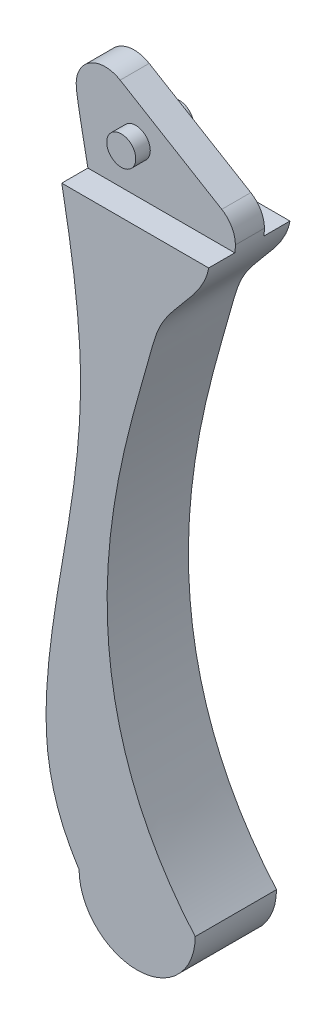
ISO-10303-21;
HEADER;
FILE_DESCRIPTION(('STEP AP214'),'2;1');
FILE_NAME('part.step','',(''),(''),'','','');
FILE_SCHEMA(('AUTOMOTIVE_DESIGN { 1 0 10303 214 1 1 1 1 }'));
ENDSEC;
DATA;
#1=APPLICATION_CONTEXT('core data for automotive mechanical design processes');
#2=APPLICATION_PROTOCOL_DEFINITION('international standard','automotive_design',2000,#1);
#3=PRODUCT_CONTEXT('',#1,'mechanical');
#4=PRODUCT('Part','Part','',(#3));
#5=PRODUCT_RELATED_PRODUCT_CATEGORY('part','',(#4));
#6=PRODUCT_DEFINITION_FORMATION('','',#4);
#7=PRODUCT_DEFINITION_CONTEXT('part definition',#1,'design');
#8=PRODUCT_DEFINITION('design','',#6,#7);
#9=PRODUCT_DEFINITION_SHAPE('','',#8);
#10=(LENGTH_UNIT() NAMED_UNIT(*) SI_UNIT(.MILLI.,.METRE.));
#11=(NAMED_UNIT(*) PLANE_ANGLE_UNIT() SI_UNIT($,.RADIAN.));
#12=(NAMED_UNIT(*) SI_UNIT($,.STERADIAN.) SOLID_ANGLE_UNIT());
#13=UNCERTAINTY_MEASURE_WITH_UNIT(LENGTH_MEASURE(1.E-05),#10,'distance_accuracy_value','');
#14=(GEOMETRIC_REPRESENTATION_CONTEXT(3) GLOBAL_UNCERTAINTY_ASSIGNED_CONTEXT((#13)) GLOBAL_UNIT_ASSIGNED_CONTEXT((#10,
#11,#12)) REPRESENTATION_CONTEXT('',''));
#15=CARTESIAN_POINT('',(0.,0.,0.));
#16=DIRECTION('',(0.,0.,1.));
#17=DIRECTION('',(1.,0.,0.));
#18=AXIS2_PLACEMENT_3D('',#15,#16,#17);
#19=CARTESIAN_POINT('',(-10.,0.,28.));
#20=CARTESIAN_POINT('',(-10.,-6.03362241087099,28.));
#21=CARTESIAN_POINT('',(-1.93515900796353,-36.5677958941885,28.));
#22=CARTESIAN_POINT('',(2.93061813689168,-106.909125291221,28.));
#23=CARTESIAN_POINT('',(-14.496902925897,-160.94466209144,28.));
#24=CARTESIAN_POINT('',(-10.7783777396493,-208.408825579284,28.));
#25=CARTESIAN_POINT('',(3.68142325720505E-13,-225.000000000001,28.));
#26=B_SPLINE_CURVE_WITH_KNOTS('',3,(#19,#20,#21,#22,#23,#24,#25),.UNSPECIFIED.,.F.,.F.,(4,1,1,1,
4),(0.,0.308474866148458,0.388557836899197,0.800829707507387,1.),.UNSPECIFIED.);
#27=DIRECTION('',(0.,0.,-1.));
#28=VECTOR('',#27,1.);
#29=SURFACE_OF_LINEAR_EXTRUSION('',#26,#28);
#30=DIRECTION('',(0.,0.,-1.));
#31=VECTOR('',#30,1.);
#32=CARTESIAN_POINT('',(-10.,0.,28.));
#33=LINE('',#32,#31);
#34=CARTESIAN_POINT('',(-10.,0.,19.));
#35=VERTEX_POINT('',#34);
#36=CARTESIAN_POINT('',(-10.,0.,9.00000000000001));
#37=VERTEX_POINT('',#36);
#38=EDGE_CURVE('E165',#35,#37,#33,.T.);
#39=ORIENTED_EDGE('',*,*,#38,.T.);
#40=CARTESIAN_POINT('',(-10.,0.,9.00000000000001));
#41=CARTESIAN_POINT('',(-10.,-6.03362241087099,9.00000000000001));
#42=CARTESIAN_POINT('',(-1.93515900796353,-36.5677958941885,9.00000000000001));
#43=CARTESIAN_POINT('',(2.93061813689168,-106.909125291221,9.00000000000001));
#44=CARTESIAN_POINT('',(-14.496902925897,-160.94466209144,9.00000000000001));
#45=CARTESIAN_POINT('',(-10.7783777396493,-208.408825579284,9.00000000000001));
#46=CARTESIAN_POINT('',(3.68142325720505E-13,-225.000000000001,9.00000000000001));
#47=B_SPLINE_CURVE_WITH_KNOTS('',3,(#40,#41,#42,#43,#44,#45,#46),.UNSPECIFIED.,.F.,.F.,(4,1,1,1,
4),(0.,0.308474866148458,0.388557836899197,0.800829707507387,1.),.UNSPECIFIED.);
#48=CARTESIAN_POINT('',(-5.96926724813891,-23.2129695897276,9.00000000000001));
#49=VERTEX_POINT('',#48);
#50=EDGE_CURVE('E135',#37,#49,#47,.T.);
#51=ORIENTED_EDGE('',*,*,#50,.T.);
#52=DIRECTION('',(0.,0.,-1.));
#53=VECTOR('',#52,1.);
#54=CARTESIAN_POINT('',(-5.96926724813893,-23.2129695897276,28.));
#55=LINE('',#54,#53);
#56=CARTESIAN_POINT('',(-5.96926724813956,-23.2129695897276,0.));
#57=VERTEX_POINT('',#56);
#58=EDGE_CURVE('E121',#49,#57,#55,.T.);
#59=ORIENTED_EDGE('',*,*,#58,.T.);
#60=CARTESIAN_POINT('',(-10.,0.,0.));
#61=CARTESIAN_POINT('',(-10.,-6.03362241087099,0.));
#62=CARTESIAN_POINT('',(-1.93515900796353,-36.5677958941885,0.));
#63=CARTESIAN_POINT('',(2.93061813689168,-106.909125291221,0.));
#64=CARTESIAN_POINT('',(-14.496902925897,-160.94466209144,0.));
#65=CARTESIAN_POINT('',(-10.7783777396493,-208.408825579284,0.));
#66=CARTESIAN_POINT('',(3.68142325720505E-13,-225.000000000001,0.));
#67=B_SPLINE_CURVE_WITH_KNOTS('',3,(#60,#61,#62,#63,#64,#65,#66),.UNSPECIFIED.,.F.,.F.,(4,1,1,1,
4),(0.,0.308474866148458,0.388557836899197,0.800829707507387,1.),.UNSPECIFIED.);
#68=CARTESIAN_POINT('',(0.,-225.,0.));
#69=VERTEX_POINT('',#68);
#70=EDGE_CURVE('E132',#57,#69,#67,.T.);
#71=ORIENTED_EDGE('',*,*,#70,.T.);
#72=DIRECTION('',(0.,0.,-1.));
#73=VECTOR('',#72,1.);
#74=CARTESIAN_POINT('',(0.,-225.,28.));
#75=LINE('',#74,#73);
#76=CARTESIAN_POINT('',(0.,-225.,28.));
#77=VERTEX_POINT('',#76);
#78=EDGE_CURVE('E187',#77,#69,#75,.T.);
#79=ORIENTED_EDGE('',*,*,#78,.F.);
#80=CARTESIAN_POINT('',(-5.96926724813957,-23.2129695897242,28.));
#81=VERTEX_POINT('',#80);
#82=EDGE_CURVE('E148',#81,#77,#26,.T.);
#83=ORIENTED_EDGE('',*,*,#82,.F.);
#84=DIRECTION('',(0.,0.,-1.));
#85=VECTOR('',#84,1.);
#86=CARTESIAN_POINT('',(-5.96926724813893,-23.2129695897276,28.));
#87=LINE('',#86,#85);
#88=CARTESIAN_POINT('',(-5.96926724813954,-23.2129695897276,19.));
#89=VERTEX_POINT('',#88);
#90=EDGE_CURVE('E67',#89,#81,#87,.F.);
#91=ORIENTED_EDGE('',*,*,#90,.F.);
#92=CARTESIAN_POINT('',(-10.,0.,19.));
#93=CARTESIAN_POINT('',(-10.,-6.03362241087099,19.));
#94=CARTESIAN_POINT('',(-1.93515900796353,-36.5677958941885,19.));
#95=CARTESIAN_POINT('',(2.93061813689168,-106.909125291221,19.));
#96=CARTESIAN_POINT('',(-14.496902925897,-160.94466209144,19.));
#97=CARTESIAN_POINT('',(-10.7783777396493,-208.408825579284,19.));
#98=CARTESIAN_POINT('',(3.68142325720505E-13,-225.000000000001,19.));
#99=B_SPLINE_CURVE_WITH_KNOTS('',3,(#92,#93,#94,#95,#96,#97,#98),.UNSPECIFIED.,.F.,.F.,(4,1,1,1,
4),(0.,0.308474866148458,0.388557836899197,0.800829707507387,1.),.UNSPECIFIED.);
#100=EDGE_CURVE('E199',#35,#89,#99,.T.);
#101=ORIENTED_EDGE('',*,*,#100,.F.);
#102=EDGE_LOOP('',(#39,#51,#59,#71,#79,#83,#91,#101));
#103=FACE_BOUND('',#102,.T.);
#104=ADVANCED_FACE('F43',(#103),#29,.F.);
#105=CARTESIAN_POINT('',(40.0000000000005,-225.000000000001,28.));
#106=CARTESIAN_POINT('',(-10.3800229081239,-166.862499306467,28.));
#107=CARTESIAN_POINT('',(19.0268418331791,-81.3215405612371,28.));
#108=CARTESIAN_POINT('',(28.8894251367706,-41.7828993815234,28.));
#109=CARTESIAN_POINT('',(44.8377491223541,-31.3693909355162,28.));
#110=CARTESIAN_POINT('',(44.8377491223541,-20.7581894326837,28.));
#111=B_SPLINE_CURVE_WITH_KNOTS('',3,(#105,#106,#107,#108,#109,#110),.UNSPECIFIED.,.F.,.F.,(4,1,
1,4),(0.,0.656664832232096,0.756664832232096,1.),.UNSPECIFIED.);
#112=DIRECTION('',(0.,0.,-1.));
#113=VECTOR('',#112,1.);
#114=SURFACE_OF_LINEAR_EXTRUSION('',#111,#113);
#115=DIRECTION('',(0.,0.,-1.));
#116=VECTOR('',#115,1.);
#117=CARTESIAN_POINT('',(44.6351275969466,-23.2129695897276,28.));
#118=LINE('',#117,#116);
#119=CARTESIAN_POINT('',(44.6351275985528,-23.212969580011,0.));
#120=VERTEX_POINT('',#119);
#121=CARTESIAN_POINT('',(44.6351275969466,-23.2129695897276,9.00000000000001));
#122=VERTEX_POINT('',#121);
#123=EDGE_CURVE('E59',#120,#122,#118,.F.);
#124=ORIENTED_EDGE('',*,*,#123,.T.);
#125=CARTESIAN_POINT('',(40.0000000000005,-225.000000000001,9.00000000000001));
#126=CARTESIAN_POINT('',(-10.3800229081239,-166.862499306467,9.00000000000001));
#127=CARTESIAN_POINT('',(19.0268418331791,-81.3215405612371,9.00000000000001));
#128=CARTESIAN_POINT('',(28.8894251367706,-41.7828993815234,9.00000000000001));
#129=CARTESIAN_POINT('',(44.8377491223541,-31.3693909355162,9.00000000000001));
#130=CARTESIAN_POINT('',(44.8377491223541,-20.7581894326837,9.00000000000001));
#131=B_SPLINE_CURVE_WITH_KNOTS('',3,(#125,#126,#127,#128,#129,#130),.UNSPECIFIED.,.F.,.F.,(4,1,
1,4),(0.,0.656664832232096,0.756664832232096,1.),.UNSPECIFIED.);
#132=CARTESIAN_POINT('',(44.8377491223541,-20.7581894326837,9.00000000000001));
#133=VERTEX_POINT('',#132);
#134=EDGE_CURVE('E216',#122,#133,#131,.T.);
#135=ORIENTED_EDGE('',*,*,#134,.T.);
#136=DIRECTION('',(0.,0.,-1.));
#137=VECTOR('',#136,1.);
#138=CARTESIAN_POINT('',(44.8377491223541,-20.7581894326837,28.));
#139=LINE('',#138,#137);
#140=CARTESIAN_POINT('',(44.8377491223541,-20.7581894326837,19.));
#141=VERTEX_POINT('',#140);
#142=EDGE_CURVE('E179',#141,#133,#139,.T.);
#143=ORIENTED_EDGE('',*,*,#142,.F.);
#144=CARTESIAN_POINT('',(40.0000000000005,-225.000000000001,19.));
#145=CARTESIAN_POINT('',(-10.3800229081239,-166.862499306467,19.));
#146=CARTESIAN_POINT('',(19.0268418331791,-81.3215405612371,19.));
#147=CARTESIAN_POINT('',(28.8894251367706,-41.7828993815234,19.));
#148=CARTESIAN_POINT('',(44.8377491223541,-31.3693909355162,19.));
#149=CARTESIAN_POINT('',(44.8377491223541,-20.7581894326837,19.));
#150=B_SPLINE_CURVE_WITH_KNOTS('',3,(#144,#145,#146,#147,#148,#149),.UNSPECIFIED.,.F.,.F.,(4,1,
1,4),(0.,0.656664832232096,0.756664832232096,1.),.UNSPECIFIED.);
#151=CARTESIAN_POINT('',(44.6351275985528,-23.2129695897276,19.));
#152=VERTEX_POINT('',#151);
#153=EDGE_CURVE('E207',#152,#141,#150,.T.);
#154=ORIENTED_EDGE('',*,*,#153,.F.);
#155=DIRECTION('',(0.,0.,-1.));
#156=VECTOR('',#155,1.);
#157=CARTESIAN_POINT('',(44.6351275969466,-23.2129695897276,28.));
#158=LINE('',#157,#156);
#159=CARTESIAN_POINT('',(44.6351275985528,-23.2129695897276,28.));
#160=VERTEX_POINT('',#159);
#161=EDGE_CURVE('E220',#160,#152,#158,.T.);
#162=ORIENTED_EDGE('',*,*,#161,.F.);
#163=CARTESIAN_POINT('',(40.0000000000005,-225.000000000001,28.));
#164=VERTEX_POINT('',#163);
#165=EDGE_CURVE('E155',#164,#160,#111,.T.);
#166=ORIENTED_EDGE('',*,*,#165,.F.);
#167=DIRECTION('',(0.,0.,-1.));
#168=VECTOR('',#167,1.);
#169=CARTESIAN_POINT('',(40.0000000000005,-225.000000000001,28.));
#170=LINE('',#169,#168);
#171=CARTESIAN_POINT('',(40.0000000000005,-225.,0.));
#172=VERTEX_POINT('',#171);
#173=EDGE_CURVE('E183',#164,#172,#170,.T.);
#174=ORIENTED_EDGE('',*,*,#173,.T.);
#175=CARTESIAN_POINT('',(40.0000000000005,-225.000000000001,0.));
#176=CARTESIAN_POINT('',(-10.3800229081239,-166.862499306467,0.));
#177=CARTESIAN_POINT('',(19.0268418331791,-81.3215405612371,0.));
#178=CARTESIAN_POINT('',(28.8894251367706,-41.7828993815234,0.));
#179=CARTESIAN_POINT('',(44.8377491223541,-31.3693909355162,0.));
#180=CARTESIAN_POINT('',(44.8377491223541,-20.7581894326837,0.));
#181=B_SPLINE_CURVE_WITH_KNOTS('',3,(#175,#176,#177,#178,#179,#180),.UNSPECIFIED.,.F.,.F.,(4,1,
1,4),(0.,0.656664832232096,0.756664832232096,1.),.UNSPECIFIED.);
#182=EDGE_CURVE('E144',#172,#120,#181,.T.);
#183=ORIENTED_EDGE('',*,*,#182,.T.);
#184=EDGE_LOOP('',(#124,#135,#143,#154,#162,#166,#174,#183));
#185=FACE_BOUND('',#184,.T.);
#186=ADVANCED_FACE('F272',(#185),#114,.F.);
#187=CARTESIAN_POINT('',(35.1724989171882,-20.7581894326837,28.));
#188=DIRECTION('',(0.,0.,-1.));
#189=DIRECTION('',(-1.,0.,0.));
#190=AXIS2_PLACEMENT_3D('',#187,#188,#189);
#191=CYLINDRICAL_SURFACE('',#190,9.66525020516587);
#192=ORIENTED_EDGE('',*,*,#142,.T.);
#193=CARTESIAN_POINT('',(35.1724989171882,-20.7581894326837,9.00000000000001));
#194=DIRECTION('',(0.,0.,1.));
#195=DIRECTION('',(0.,-1.,0.));
#196=AXIS2_PLACEMENT_3D('',#193,#194,#195);
#197=CIRCLE('',#196,9.66525020516587);
#198=CARTESIAN_POINT('',(40.1530701392559,-12.4750154136032,9.));
#199=VERTEX_POINT('',#198);
#200=EDGE_CURVE('E223',#133,#199,#197,.T.);
#201=ORIENTED_EDGE('',*,*,#200,.T.);
#202=DIRECTION('',(0.,0.,-1.));
#203=VECTOR('',#202,1.);
#204=CARTESIAN_POINT('',(40.1530701392559,-12.4750154136032,28.));
#205=LINE('',#204,#203);
#206=CARTESIAN_POINT('',(40.1530701392559,-12.4750154136032,19.));
#207=VERTEX_POINT('',#206);
#208=EDGE_CURVE('E175',#207,#199,#205,.T.);
#209=ORIENTED_EDGE('',*,*,#208,.F.);
#210=CARTESIAN_POINT('',(35.1724989171882,-20.7581894326837,19.));
#211=DIRECTION('',(0.,0.,1.));
#212=DIRECTION('',(0.,-1.,0.));
#213=AXIS2_PLACEMENT_3D('',#210,#211,#212);
#214=CIRCLE('',#213,9.66525020516587);
#215=EDGE_CURVE('E240',#141,#207,#214,.T.);
#216=ORIENTED_EDGE('',*,*,#215,.F.);
#217=EDGE_LOOP('',(#192,#201,#209,#216));
#218=FACE_BOUND('',#217,.T.);
#219=ADVANCED_FACE('F279',(#218),#191,.T.);
#220=CARTESIAN_POINT('',(5.15307013925591,8.57005648405593,28.));
#221=DIRECTION('',(-0.515307013925591,-0.857005648405593,0.));
#222=DIRECTION('',(0.857005648405593,-0.515307013925591,0.));
#223=AXIS2_PLACEMENT_3D('',#220,#221,#222);
#224=PLANE('',#223);
#225=ORIENTED_EDGE('',*,*,#208,.T.);
#226=DIRECTION('',(-0.857005648405593,0.515307013925591,0.));
#227=VECTOR('',#226,1.);
#228=CARTESIAN_POINT('',(5.15307013925591,8.57005648405593,9.));
#229=LINE('',#228,#227);
#230=CARTESIAN_POINT('',(5.15307013925591,8.57005648405593,9.));
#231=VERTEX_POINT('',#230);
#232=EDGE_CURVE('E137',#199,#231,#229,.T.);
#233=ORIENTED_EDGE('',*,*,#232,.T.);
#234=DIRECTION('',(0.,0.,-1.));
#235=VECTOR('',#234,1.);
#236=CARTESIAN_POINT('',(5.15307013925591,8.57005648405593,28.));
#237=LINE('',#236,#235);
#238=CARTESIAN_POINT('',(5.15307013925591,8.57005648405593,19.));
#239=VERTEX_POINT('',#238);
#240=EDGE_CURVE('E171',#239,#231,#237,.T.);
#241=ORIENTED_EDGE('',*,*,#240,.F.);
#242=DIRECTION('',(-0.857005648405593,0.515307013925591,0.));
#243=VECTOR('',#242,1.);
#244=CARTESIAN_POINT('',(5.15307013925591,8.57005648405593,19.));
#245=LINE('',#244,#243);
#246=EDGE_CURVE('E201',#207,#239,#245,.T.);
#247=ORIENTED_EDGE('',*,*,#246,.F.);
#248=EDGE_LOOP('',(#225,#233,#241,#247));
#249=FACE_BOUND('',#248,.T.);
#250=ADVANCED_FACE('F295',(#249),#224,.F.);
#251=CARTESIAN_POINT('',(0.,0.,28.));
#252=DIRECTION('',(0.,0.,-1.));
#253=DIRECTION('',(-1.,0.,0.));
#254=AXIS2_PLACEMENT_3D('',#251,#252,#253);
#255=CYLINDRICAL_SURFACE('',#254,10.);
#256=CARTESIAN_POINT('',(0.,0.,9.00000000000001));
#257=DIRECTION('',(0.,0.,1.));
#258=DIRECTION('',(0.,-1.,0.));
#259=AXIS2_PLACEMENT_3D('',#256,#257,#258);
#260=CIRCLE('',#259,10.);
#261=EDGE_CURVE('E11',#231,#37,#260,.T.);
#262=ORIENTED_EDGE('',*,*,#261,.T.);
#263=ORIENTED_EDGE('',*,*,#38,.F.);
#264=CARTESIAN_POINT('',(0.,0.,19.));
#265=DIRECTION('',(0.,0.,1.));
#266=DIRECTION('',(0.,-1.,0.));
#267=AXIS2_PLACEMENT_3D('',#264,#265,#266);
#268=CIRCLE('',#267,10.);
#269=EDGE_CURVE('E127',#239,#35,#268,.T.);
#270=ORIENTED_EDGE('',*,*,#269,.F.);
#271=ORIENTED_EDGE('',*,*,#240,.T.);
#272=EDGE_LOOP('',(#262,#263,#270,#271));
#273=FACE_BOUND('',#272,.T.);
#274=ADVANCED_FACE('F209',(#273),#255,.T.);
#275=CARTESIAN_POINT('',(-1.14649543087523,-105.772903585385,28.));
#276=DIRECTION('',(0.,0.,-1.));
#277=DIRECTION('',(-1.,0.,0.));
#278=AXIS2_PLACEMENT_3D('',#275,#276,#277);
#279=PLANE('',#278);
#280=DIRECTION('',(1.,0.,0.));
#281=VECTOR('',#280,1.);
#282=CARTESIAN_POINT('',(-1.14649543087523,-23.2129695897276,28.));
#283=LINE('',#282,#281);
#284=EDGE_CURVE('E190',#81,#160,#283,.T.);
#285=ORIENTED_EDGE('',*,*,#284,.F.);
#286=ORIENTED_EDGE('',*,*,#82,.T.);
#287=CARTESIAN_POINT('',(20.0000000000003,-225.,28.));
#288=DIRECTION('',(0.,0.,1.));
#289=DIRECTION('',(1.,0.,0.));
#290=AXIS2_PLACEMENT_3D('',#287,#288,#289);
#291=CIRCLE('',#290,20.0000000000003);
#292=EDGE_CURVE('E150',#77,#164,#291,.T.);
#293=ORIENTED_EDGE('',*,*,#292,.T.);
#294=ORIENTED_EDGE('',*,*,#165,.T.);
#295=EDGE_LOOP('',(#285,#286,#293,#294));
#296=FACE_BOUND('',#295,.T.);
#297=ADVANCED_FACE('F267',(#296),#279,.F.);
#298=CARTESIAN_POINT('',(-1.14649543087523,-105.772903585385,0.));
#299=DIRECTION('',(0.,0.,-1.));
#300=DIRECTION('',(-1.,0.,0.));
#301=AXIS2_PLACEMENT_3D('',#298,#299,#300);
#302=PLANE('',#301);
#303=DIRECTION('',(-1.,0.,0.));
#304=VECTOR('',#303,1.);
#305=CARTESIAN_POINT('',(-1.14649543087523,-23.2129695897276,0.));
#306=LINE('',#305,#304);
#307=EDGE_CURVE('E52',#120,#57,#306,.T.);
#308=ORIENTED_EDGE('',*,*,#307,.F.);
#309=ORIENTED_EDGE('',*,*,#182,.F.);
#310=CARTESIAN_POINT('',(20.0000000000003,-225.,0.));
#311=DIRECTION('',(0.,0.,1.));
#312=DIRECTION('',(1.,0.,0.));
#313=AXIS2_PLACEMENT_3D('',#310,#311,#312);
#314=CIRCLE('',#313,20.0000000000003);
#315=EDGE_CURVE('E141',#69,#172,#314,.T.);
#316=ORIENTED_EDGE('',*,*,#315,.F.);
#317=ORIENTED_EDGE('',*,*,#70,.F.);
#318=EDGE_LOOP('',(#308,#309,#316,#317));
#319=FACE_BOUND('',#318,.T.);
#320=ADVANCED_FACE('F139',(#319),#302,.T.);
#321=CARTESIAN_POINT('',(20.0000000000003,-225.,28.));
#322=DIRECTION('',(0.,0.,1.));
#323=DIRECTION('',(1.,0.,0.));
#324=AXIS2_PLACEMENT_3D('',#321,#322,#323);
#325=CYLINDRICAL_SURFACE('',#324,20.0000000000003);
#326=ORIENTED_EDGE('',*,*,#78,.T.);
#327=ORIENTED_EDGE('',*,*,#315,.T.);
#328=ORIENTED_EDGE('',*,*,#173,.F.);
#329=ORIENTED_EDGE('',*,*,#292,.F.);
#330=EDGE_LOOP('',(#326,#327,#328,#329));
#331=FACE_BOUND('',#330,.T.);
#332=ADVANCED_FACE('F336',(#331),#325,.T.);
#333=CARTESIAN_POINT('',(45.,10.,19.));
#334=DIRECTION('',(0.,0.,1.));
#335=DIRECTION('',(0.,-1.,0.));
#336=AXIS2_PLACEMENT_3D('',#333,#334,#335);
#337=PLANE('',#336);
#338=CARTESIAN_POINT('',(10.5251464932153,-7.24532712062197,19.));
#339=DIRECTION('',(0.,0.,1.));
#340=DIRECTION('',(1.,0.,0.));
#341=AXIS2_PLACEMENT_3D('',#338,#339,#340);
#342=CIRCLE('',#341,5.);
#343=CARTESIAN_POINT('',(15.5251464932153,-7.24532712062197,19.));
#344=VERTEX_POINT('',#343);
#345=EDGE_CURVE('E288',#344,#344,#342,.T.);
#346=ORIENTED_EDGE('',*,*,#345,.F.);
#347=EDGE_LOOP('',(#346));
#348=FACE_BOUND('',#347,.T.);
#349=ORIENTED_EDGE('',*,*,#100,.T.);
#350=DIRECTION('',(-1.,0.,0.));
#351=VECTOR('',#350,1.);
#352=CARTESIAN_POINT('',(45.,-23.2129695897276,19.));
#353=LINE('',#352,#351);
#354=EDGE_CURVE('E215',#152,#89,#353,.T.);
#355=ORIENTED_EDGE('',*,*,#354,.F.);
#356=ORIENTED_EDGE('',*,*,#153,.T.);
#357=ORIENTED_EDGE('',*,*,#215,.T.);
#358=ORIENTED_EDGE('',*,*,#246,.T.);
#359=ORIENTED_EDGE('',*,*,#269,.T.);
#360=EDGE_LOOP('',(#349,#355,#356,#357,#358,#359));
#361=FACE_BOUND('',#360,.T.);
#362=ADVANCED_FACE('F197',(#348,#361),#337,.T.);
#363=CARTESIAN_POINT('',(45.,-23.2129695897276,28.));
#364=DIRECTION('',(0.,1.,0.));
#365=DIRECTION('',(0.,0.,1.));
#366=AXIS2_PLACEMENT_3D('',#363,#364,#365);
#367=PLANE('',#366);
#368=ORIENTED_EDGE('',*,*,#90,.T.);
#369=ORIENTED_EDGE('',*,*,#284,.T.);
#370=ORIENTED_EDGE('',*,*,#161,.T.);
#371=ORIENTED_EDGE('',*,*,#354,.T.);
#372=EDGE_LOOP('',(#368,#369,#370,#371));
#373=FACE_BOUND('',#372,.T.);
#374=ADVANCED_FACE('F275',(#373),#367,.T.);
#375=CARTESIAN_POINT('',(45.,10.,9.));
#376=DIRECTION('',(0.,0.,1.));
#377=DIRECTION('',(0.,-1.,0.));
#378=AXIS2_PLACEMENT_3D('',#375,#376,#377);
#379=PLANE('',#378);
#380=CARTESIAN_POINT('',(10.5251464932153,-7.24532712062197,9.));
#381=DIRECTION('',(0.,0.,1.));
#382=DIRECTION('',(1.,0.,0.));
#383=AXIS2_PLACEMENT_3D('',#380,#381,#382);
#384=CIRCLE('',#383,5.);
#385=CARTESIAN_POINT('',(15.5251464932153,-7.24532712062197,9.));
#386=VERTEX_POINT('',#385);
#387=EDGE_CURVE('E476',#386,#386,#384,.T.);
#388=ORIENTED_EDGE('',*,*,#387,.T.);
#389=EDGE_LOOP('',(#388));
#390=FACE_BOUND('',#389,.T.);
#391=ORIENTED_EDGE('',*,*,#50,.F.);
#392=ORIENTED_EDGE('',*,*,#261,.F.);
#393=ORIENTED_EDGE('',*,*,#232,.F.);
#394=ORIENTED_EDGE('',*,*,#200,.F.);
#395=ORIENTED_EDGE('',*,*,#134,.F.);
#396=DIRECTION('',(-1.,0.,0.));
#397=VECTOR('',#396,1.);
#398=CARTESIAN_POINT('',(45.,-23.2129695897276,9.00000000000001));
#399=LINE('',#398,#397);
#400=EDGE_CURVE('E213',#122,#49,#399,.T.);
#401=ORIENTED_EDGE('',*,*,#400,.T.);
#402=EDGE_LOOP('',(#391,#392,#393,#394,#395,#401));
#403=FACE_BOUND('',#402,.T.);
#404=ADVANCED_FACE('F212',(#390,#403),#379,.F.);
#405=CARTESIAN_POINT('',(45.,-23.2129695897276,0.));
#406=DIRECTION('',(0.,-1.,0.));
#407=DIRECTION('',(0.,0.,-1.));
#408=AXIS2_PLACEMENT_3D('',#405,#406,#407);
#409=PLANE('',#408);
#410=ORIENTED_EDGE('',*,*,#400,.F.);
#411=ORIENTED_EDGE('',*,*,#123,.F.);
#412=ORIENTED_EDGE('',*,*,#307,.T.);
#413=ORIENTED_EDGE('',*,*,#58,.F.);
#414=EDGE_LOOP('',(#410,#411,#412,#413));
#415=FACE_BOUND('',#414,.T.);
#416=ADVANCED_FACE('F120',(#415),#409,.F.);
#417=CARTESIAN_POINT('',(10.5251464932153,-7.24532712062197,24.));
#418=DIRECTION('',(0.,0.,-1.));
#419=DIRECTION('',(-1.,0.,0.));
#420=AXIS2_PLACEMENT_3D('',#417,#418,#419);
#421=CYLINDRICAL_SURFACE('',#420,5.);
#422=CARTESIAN_POINT('',(10.5251464932153,-7.24532712062197,24.));
#423=DIRECTION('',(0.,0.,1.));
#424=DIRECTION('',(1.,0.,0.));
#425=AXIS2_PLACEMENT_3D('',#422,#423,#424);
#426=CIRCLE('',#425,5.);
#427=CARTESIAN_POINT('',(15.5251464932153,-7.24532712062197,24.));
#428=VERTEX_POINT('',#427);
#429=EDGE_CURVE('E282',#428,#428,#426,.T.);
#430=ORIENTED_EDGE('',*,*,#429,.F.);
#431=EDGE_LOOP('',(#430));
#432=FACE_BOUND('',#431,.T.);
#433=ORIENTED_EDGE('',*,*,#345,.T.);
#434=EDGE_LOOP('',(#433));
#435=FACE_BOUND('',#434,.T.);
#436=ADVANCED_FACE('F348',(#432,#435),#421,.T.);
#437=CARTESIAN_POINT('',(10.5251464932153,-7.24532712062197,24.));
#438=DIRECTION('',(0.,0.,1.));
#439=DIRECTION('',(1.,0.,0.));
#440=AXIS2_PLACEMENT_3D('',#437,#438,#439);
#441=PLANE('',#440);
#442=ORIENTED_EDGE('',*,*,#429,.T.);
#443=EDGE_LOOP('',(#442));
#444=FACE_BOUND('',#443,.T.);
#445=ADVANCED_FACE('F373',(#444),#441,.T.);
#446=CARTESIAN_POINT('',(10.5251464932153,-7.24532712062197,4.));
#447=DIRECTION('',(0.,0.,1.));
#448=DIRECTION('',(1.,0.,0.));
#449=AXIS2_PLACEMENT_3D('',#446,#447,#448);
#450=CYLINDRICAL_SURFACE('',#449,5.);
#451=CARTESIAN_POINT('',(10.5251464932153,-7.24532712062197,4.));
#452=DIRECTION('',(0.,0.,1.));
#453=DIRECTION('',(1.,0.,0.));
#454=AXIS2_PLACEMENT_3D('',#451,#452,#453);
#455=CIRCLE('',#454,5.);
#456=CARTESIAN_POINT('',(15.5251464932153,-7.24532712062197,4.));
#457=VERTEX_POINT('',#456);
#458=EDGE_CURVE('E474',#457,#457,#455,.T.);
#459=ORIENTED_EDGE('',*,*,#458,.T.);
#460=EDGE_LOOP('',(#459));
#461=FACE_BOUND('',#460,.T.);
#462=ORIENTED_EDGE('',*,*,#387,.F.);
#463=EDGE_LOOP('',(#462));
#464=FACE_BOUND('',#463,.T.);
#465=ADVANCED_FACE('F384',(#461,#464),#450,.T.);
#466=CARTESIAN_POINT('',(10.5251464932153,-7.24532712062197,4.));
#467=DIRECTION('',(0.,0.,-1.));
#468=DIRECTION('',(1.,0.,0.));
#469=AXIS2_PLACEMENT_3D('',#466,#467,#468);
#470=PLANE('',#469);
#471=ORIENTED_EDGE('',*,*,#458,.F.);
#472=EDGE_LOOP('',(#471));
#473=FACE_BOUND('',#472,.T.);
#474=ADVANCED_FACE('F403',(#473),#470,.T.);
#475=CLOSED_SHELL('',(#104,#186,#219,#250,#274,#297,#320,#332,#362,#374,#404,#416,#436,#445,
#465,#474));
#476=MANIFOLD_SOLID_BREP('B2',#475);
#477=ADVANCED_BREP_SHAPE_REPRESENTATION('',(#18,#476),#14);
#478=SHAPE_DEFINITION_REPRESENTATION(#9,#477);
ENDSEC;
END-ISO-10303-21;
